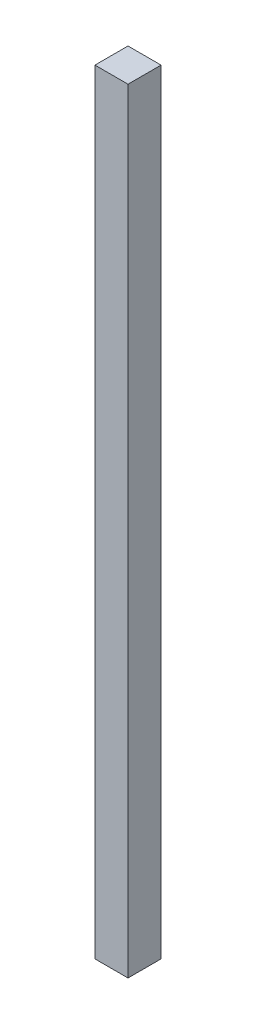
ISO-10303-21;
HEADER;
FILE_DESCRIPTION(('STEP AP214'),'2;1');
FILE_NAME('part.step','',(''),(''),'','','');
FILE_SCHEMA(('AUTOMOTIVE_DESIGN { 1 0 10303 214 1 1 1 1 }'));
ENDSEC;
DATA;
#1=APPLICATION_CONTEXT('core data for automotive mechanical design processes');
#2=APPLICATION_PROTOCOL_DEFINITION('international standard','automotive_design',2000,#1);
#3=PRODUCT_CONTEXT('',#1,'mechanical');
#4=PRODUCT('Part','Part','',(#3));
#5=PRODUCT_RELATED_PRODUCT_CATEGORY('part','',(#4));
#6=PRODUCT_DEFINITION_FORMATION('','',#4);
#7=PRODUCT_DEFINITION_CONTEXT('part definition',#1,'design');
#8=PRODUCT_DEFINITION('design','',#6,#7);
#9=PRODUCT_DEFINITION_SHAPE('','',#8);
#10=(LENGTH_UNIT() NAMED_UNIT(*) SI_UNIT(.MILLI.,.METRE.));
#11=(NAMED_UNIT(*) PLANE_ANGLE_UNIT() SI_UNIT($,.RADIAN.));
#12=(NAMED_UNIT(*) SI_UNIT($,.STERADIAN.) SOLID_ANGLE_UNIT());
#13=UNCERTAINTY_MEASURE_WITH_UNIT(LENGTH_MEASURE(1.E-05),#10,'distance_accuracy_value','');
#14=(GEOMETRIC_REPRESENTATION_CONTEXT(3) GLOBAL_UNCERTAINTY_ASSIGNED_CONTEXT((#13)) GLOBAL_UNIT_ASSIGNED_CONTEXT((#10,
#11,#12)) REPRESENTATION_CONTEXT('',''));
#15=CARTESIAN_POINT('',(0.,0.,0.));
#16=DIRECTION('',(0.,0.,1.));
#17=DIRECTION('',(1.,0.,0.));
#18=AXIS2_PLACEMENT_3D('',#15,#16,#17);
#19=CARTESIAN_POINT('',(0.,609.6,0.));
#20=DIRECTION('',(1.,0.,0.));
#21=DIRECTION('',(0.,0.,-1.));
#22=AXIS2_PLACEMENT_3D('',#19,#20,#21);
#23=PLANE('',#22);
#24=DIRECTION('',(0.,-1.,0.));
#25=VECTOR('',#24,1.);
#26=CARTESIAN_POINT('',(0.,609.6,0.));
#27=LINE('',#26,#25);
#28=CARTESIAN_POINT('',(0.,594.528954968234,0.));
#29=VERTEX_POINT('',#28);
#30=CARTESIAN_POINT('',(0.,0.,0.));
#31=VERTEX_POINT('',#30);
#32=EDGE_CURVE('E11',#29,#31,#27,.T.);
#33=ORIENTED_EDGE('',*,*,#32,.F.);
#34=DIRECTION('',(0.,0.,-1.));
#35=VECTOR('',#34,1.);
#36=CARTESIAN_POINT('',(0.,594.528954968234,29.5346643513944));
#37=LINE('',#36,#35);
#38=CARTESIAN_POINT('',(0.,594.528954968234,-25.4));
#39=VERTEX_POINT('',#38);
#40=EDGE_CURVE('E89',#29,#39,#37,.T.);
#41=ORIENTED_EDGE('',*,*,#40,.T.);
#42=DIRECTION('',(0.,-1.,0.));
#43=VECTOR('',#42,1.);
#44=CARTESIAN_POINT('',(0.,609.6,-25.4));
#45=LINE('',#44,#43);
#46=CARTESIAN_POINT('',(0.,0.,-25.4));
#47=VERTEX_POINT('',#46);
#48=EDGE_CURVE('E71',#39,#47,#45,.T.);
#49=ORIENTED_EDGE('',*,*,#48,.T.);
#50=DIRECTION('',(0.,0.,1.));
#51=VECTOR('',#50,1.);
#52=CARTESIAN_POINT('',(0.,0.,0.));
#53=LINE('',#52,#51);
#54=EDGE_CURVE('E118',#47,#31,#53,.T.);
#55=ORIENTED_EDGE('',*,*,#54,.T.);
#56=EDGE_LOOP('',(#33,#41,#49,#55));
#57=FACE_BOUND('',#56,.T.);
#58=ADVANCED_FACE('F49',(#57),#23,.F.);
#59=CARTESIAN_POINT('',(0.,609.6,0.));
#60=DIRECTION('',(0.,0.,-1.));
#61=DIRECTION('',(-1.,0.,0.));
#62=AXIS2_PLACEMENT_3D('',#59,#60,#61);
#63=PLANE('',#62);
#64=DIRECTION('',(0.,-1.,0.));
#65=VECTOR('',#64,1.);
#66=CARTESIAN_POINT('',(25.4,609.6,0.));
#67=LINE('',#66,#65);
#68=CARTESIAN_POINT('',(25.4,594.528954968234,0.));
#69=VERTEX_POINT('',#68);
#70=CARTESIAN_POINT('',(25.4,0.,0.));
#71=VERTEX_POINT('',#70);
#72=EDGE_CURVE('E56',#69,#71,#67,.T.);
#73=ORIENTED_EDGE('',*,*,#72,.F.);
#74=DIRECTION('',(1.,0.,0.));
#75=VECTOR('',#74,1.);
#76=CARTESIAN_POINT('',(0.,594.528954968234,0.));
#77=LINE('',#76,#75);
#78=EDGE_CURVE('E95',#29,#69,#77,.T.);
#79=ORIENTED_EDGE('',*,*,#78,.F.);
#80=ORIENTED_EDGE('',*,*,#32,.T.);
#81=DIRECTION('',(1.,0.,0.));
#82=VECTOR('',#81,1.);
#83=CARTESIAN_POINT('',(0.,0.,0.));
#84=LINE('',#83,#82);
#85=EDGE_CURVE('E115',#31,#71,#84,.T.);
#86=ORIENTED_EDGE('',*,*,#85,.T.);
#87=EDGE_LOOP('',(#73,#79,#80,#86));
#88=FACE_BOUND('',#87,.T.);
#89=ADVANCED_FACE('F116',(#88),#63,.F.);
#90=CARTESIAN_POINT('',(25.4,609.6,0.));
#91=DIRECTION('',(-1.,0.,0.));
#92=DIRECTION('',(0.,0.,1.));
#93=AXIS2_PLACEMENT_3D('',#90,#91,#92);
#94=PLANE('',#93);
#95=DIRECTION('',(0.,-1.,0.));
#96=VECTOR('',#95,1.);
#97=CARTESIAN_POINT('',(25.4,609.6,-25.4));
#98=LINE('',#97,#96);
#99=CARTESIAN_POINT('',(25.4,594.528954968234,-25.4));
#100=VERTEX_POINT('',#99);
#101=CARTESIAN_POINT('',(25.4,0.,-25.4));
#102=VERTEX_POINT('',#101);
#103=EDGE_CURVE('E101',#100,#102,#98,.T.);
#104=ORIENTED_EDGE('',*,*,#103,.F.);
#105=DIRECTION('',(0.,0.,-1.));
#106=VECTOR('',#105,1.);
#107=CARTESIAN_POINT('',(25.4,594.528954968234,29.5346643513944));
#108=LINE('',#107,#106);
#109=EDGE_CURVE('E63',#69,#100,#108,.T.);
#110=ORIENTED_EDGE('',*,*,#109,.F.);
#111=ORIENTED_EDGE('',*,*,#72,.T.);
#112=DIRECTION('',(0.,0.,-1.));
#113=VECTOR('',#112,1.);
#114=CARTESIAN_POINT('',(25.4,0.,0.));
#115=LINE('',#114,#113);
#116=EDGE_CURVE('E104',#71,#102,#115,.T.);
#117=ORIENTED_EDGE('',*,*,#116,.T.);
#118=EDGE_LOOP('',(#104,#110,#111,#117));
#119=FACE_BOUND('',#118,.T.);
#120=ADVANCED_FACE('F111',(#119),#94,.F.);
#121=CARTESIAN_POINT('',(0.,609.6,-25.4));
#122=DIRECTION('',(0.,0.,1.));
#123=DIRECTION('',(1.,0.,0.));
#124=AXIS2_PLACEMENT_3D('',#121,#122,#123);
#125=PLANE('',#124);
#126=ORIENTED_EDGE('',*,*,#48,.F.);
#127=DIRECTION('',(-1.,0.,0.));
#128=VECTOR('',#127,1.);
#129=CARTESIAN_POINT('',(0.,594.528954968234,-25.4));
#130=LINE('',#129,#128);
#131=EDGE_CURVE('E87',#100,#39,#130,.T.);
#132=ORIENTED_EDGE('',*,*,#131,.F.);
#133=ORIENTED_EDGE('',*,*,#103,.T.);
#134=DIRECTION('',(-1.,0.,0.));
#135=VECTOR('',#134,1.);
#136=CARTESIAN_POINT('',(0.,0.,-25.4));
#137=LINE('',#136,#135);
#138=EDGE_CURVE('E99',#102,#47,#137,.T.);
#139=ORIENTED_EDGE('',*,*,#138,.T.);
#140=EDGE_LOOP('',(#126,#132,#133,#139));
#141=FACE_BOUND('',#140,.T.);
#142=ADVANCED_FACE('F97',(#141),#125,.F.);
#143=CARTESIAN_POINT('',(0.,0.,0.));
#144=DIRECTION('',(0.,-1.,0.));
#145=DIRECTION('',(0.,0.,-1.));
#146=AXIS2_PLACEMENT_3D('',#143,#144,#145);
#147=PLANE('',#146);
#148=ORIENTED_EDGE('',*,*,#54,.F.);
#149=ORIENTED_EDGE('',*,*,#138,.F.);
#150=ORIENTED_EDGE('',*,*,#116,.F.);
#151=ORIENTED_EDGE('',*,*,#85,.F.);
#152=EDGE_LOOP('',(#148,#149,#150,#151));
#153=FACE_BOUND('',#152,.T.);
#154=ADVANCED_FACE('F120',(#153),#147,.T.);
#155=CARTESIAN_POINT('',(0.,594.528954968234,29.5346643513944));
#156=DIRECTION('',(0.,-1.,0.));
#157=DIRECTION('',(0.,0.,-1.));
#158=AXIS2_PLACEMENT_3D('',#155,#156,#157);
#159=PLANE('',#158);
#160=ORIENTED_EDGE('',*,*,#78,.T.);
#161=ORIENTED_EDGE('',*,*,#109,.T.);
#162=ORIENTED_EDGE('',*,*,#131,.T.);
#163=ORIENTED_EDGE('',*,*,#40,.F.);
#164=EDGE_LOOP('',(#160,#161,#162,#163));
#165=FACE_BOUND('',#164,.T.);
#166=ADVANCED_FACE('F88',(#165),#159,.F.);
#167=CLOSED_SHELL('',(#58,#89,#120,#142,#154,#166));
#168=MANIFOLD_SOLID_BREP('B2',#167);
#169=ADVANCED_BREP_SHAPE_REPRESENTATION('',(#18,#168),#14);
#170=SHAPE_DEFINITION_REPRESENTATION(#9,#169);
ENDSEC;
END-ISO-10303-21;
